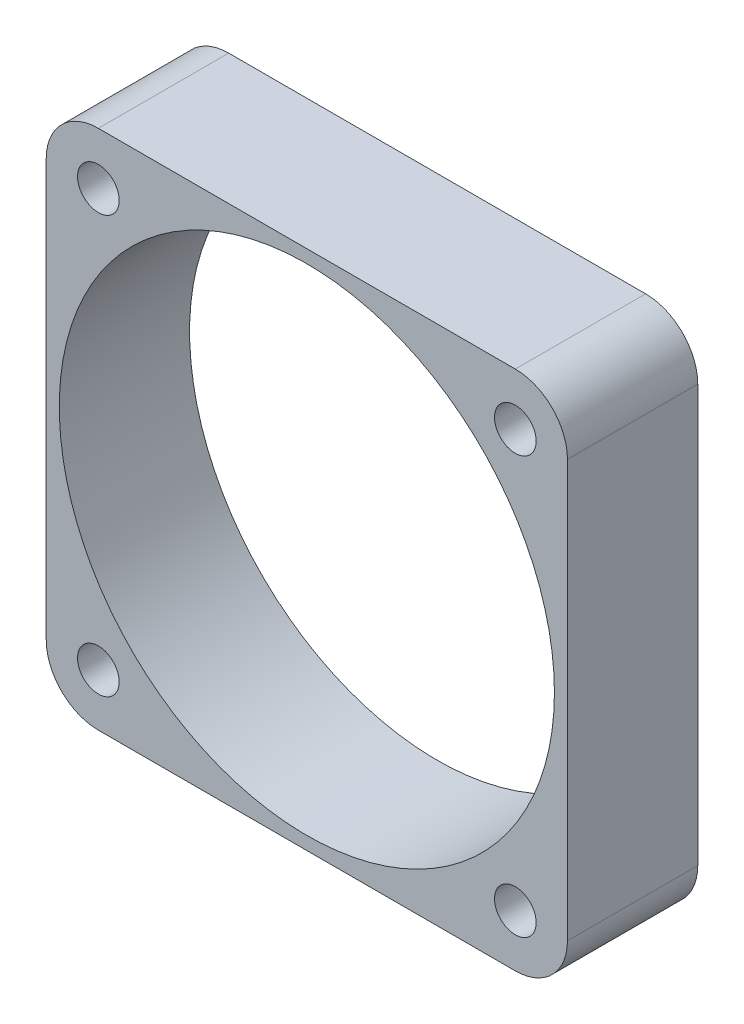
ISO-10303-21;
HEADER;
FILE_DESCRIPTION(('STEP AP214'),'2;1');
FILE_NAME('part.step','',(''),(''),'','','');
FILE_SCHEMA(('AUTOMOTIVE_DESIGN { 1 0 10303 214 1 1 1 1 }'));
ENDSEC;
DATA;
#1=APPLICATION_CONTEXT('core data for automotive mechanical design processes');
#2=APPLICATION_PROTOCOL_DEFINITION('international standard','automotive_design',2000,#1);
#3=PRODUCT_CONTEXT('',#1,'mechanical');
#4=PRODUCT('Part','Part','',(#3));
#5=PRODUCT_RELATED_PRODUCT_CATEGORY('part','',(#4));
#6=PRODUCT_DEFINITION_FORMATION('','',#4);
#7=PRODUCT_DEFINITION_CONTEXT('part definition',#1,'design');
#8=PRODUCT_DEFINITION('design','',#6,#7);
#9=PRODUCT_DEFINITION_SHAPE('','',#8);
#10=(LENGTH_UNIT() NAMED_UNIT(*) SI_UNIT(.MILLI.,.METRE.));
#11=(NAMED_UNIT(*) PLANE_ANGLE_UNIT() SI_UNIT($,.RADIAN.));
#12=(NAMED_UNIT(*) SI_UNIT($,.STERADIAN.) SOLID_ANGLE_UNIT());
#13=UNCERTAINTY_MEASURE_WITH_UNIT(LENGTH_MEASURE(1.E-05),#10,'distance_accuracy_value','');
#14=(GEOMETRIC_REPRESENTATION_CONTEXT(3) GLOBAL_UNCERTAINTY_ASSIGNED_CONTEXT((#13)) GLOBAL_UNIT_ASSIGNED_CONTEXT((#10,
#11,#12)) REPRESENTATION_CONTEXT('',''));
#15=CARTESIAN_POINT('',(0.,0.,0.));
#16=DIRECTION('',(0.,0.,1.));
#17=DIRECTION('',(1.,0.,0.));
#18=AXIS2_PLACEMENT_3D('',#15,#16,#17);
#19=CARTESIAN_POINT('',(-16.,16.,10.));
#20=DIRECTION('',(0.,0.,-1.));
#21=DIRECTION('',(-1.,0.,0.));
#22=AXIS2_PLACEMENT_3D('',#19,#20,#21);
#23=PLANE('',#22);
#24=CARTESIAN_POINT('',(16.,-16.,10.));
#25=DIRECTION('',(0.,0.,1.));
#26=DIRECTION('',(1.,0.,0.));
#27=AXIS2_PLACEMENT_3D('',#24,#25,#26);
#28=CIRCLE('',#27,1.6);
#29=CARTESIAN_POINT('',(17.6,-16.,10.));
#30=VERTEX_POINT('',#29);
#31=EDGE_CURVE('E192',#30,#30,#28,.T.);
#32=ORIENTED_EDGE('',*,*,#31,.F.);
#33=EDGE_LOOP('',(#32));
#34=FACE_BOUND('',#33,.T.);
#35=CARTESIAN_POINT('',(-16.,16.,10.));
#36=DIRECTION('',(0.,0.,1.));
#37=DIRECTION('',(1.,0.,0.));
#38=AXIS2_PLACEMENT_3D('',#35,#36,#37);
#39=CIRCLE('',#38,1.6);
#40=CARTESIAN_POINT('',(-14.4,16.,10.));
#41=VERTEX_POINT('',#40);
#42=EDGE_CURVE('E180',#41,#41,#39,.T.);
#43=ORIENTED_EDGE('',*,*,#42,.F.);
#44=EDGE_LOOP('',(#43));
#45=FACE_BOUND('',#44,.T.);
#46=CARTESIAN_POINT('',(-16.,16.,10.));
#47=DIRECTION('',(0.,0.,1.));
#48=DIRECTION('',(-1.,0.,0.));
#49=AXIS2_PLACEMENT_3D('',#46,#47,#48);
#50=CIRCLE('',#49,4.);
#51=CARTESIAN_POINT('',(-16.,20.,10.));
#52=VERTEX_POINT('',#51);
#53=CARTESIAN_POINT('',(-20.,16.,10.));
#54=VERTEX_POINT('',#53);
#55=EDGE_CURVE('E143',#52,#54,#50,.T.);
#56=ORIENTED_EDGE('',*,*,#55,.T.);
#57=DIRECTION('',(0.,-1.,0.));
#58=VECTOR('',#57,1.);
#59=CARTESIAN_POINT('',(-20.,-16.,10.));
#60=LINE('',#59,#58);
#61=CARTESIAN_POINT('',(-20.,-16.,10.));
#62=VERTEX_POINT('',#61);
#63=EDGE_CURVE('E91',#54,#62,#60,.T.);
#64=ORIENTED_EDGE('',*,*,#63,.T.);
#65=CARTESIAN_POINT('',(-16.,-16.,10.));
#66=DIRECTION('',(0.,0.,1.));
#67=DIRECTION('',(-1.,0.,0.));
#68=AXIS2_PLACEMENT_3D('',#65,#66,#67);
#69=CIRCLE('',#68,4.);
#70=CARTESIAN_POINT('',(-16.,-20.,10.));
#71=VERTEX_POINT('',#70);
#72=EDGE_CURVE('E158',#62,#71,#69,.T.);
#73=ORIENTED_EDGE('',*,*,#72,.T.);
#74=DIRECTION('',(1.,0.,0.));
#75=VECTOR('',#74,1.);
#76=CARTESIAN_POINT('',(-16.,-20.,10.));
#77=LINE('',#76,#75);
#78=CARTESIAN_POINT('',(16.,-20.,10.));
#79=VERTEX_POINT('',#78);
#80=EDGE_CURVE('E171',#71,#79,#77,.T.);
#81=ORIENTED_EDGE('',*,*,#80,.T.);
#82=CARTESIAN_POINT('',(16.,-16.,10.));
#83=DIRECTION('',(0.,0.,1.));
#84=DIRECTION('',(-1.,0.,0.));
#85=AXIS2_PLACEMENT_3D('',#82,#83,#84);
#86=CIRCLE('',#85,4.);
#87=CARTESIAN_POINT('',(20.,-16.,10.));
#88=VERTEX_POINT('',#87);
#89=EDGE_CURVE('E110',#79,#88,#86,.T.);
#90=ORIENTED_EDGE('',*,*,#89,.T.);
#91=DIRECTION('',(0.,1.,0.));
#92=VECTOR('',#91,1.);
#93=CARTESIAN_POINT('',(20.,16.,10.));
#94=LINE('',#93,#92);
#95=CARTESIAN_POINT('',(20.,16.,10.));
#96=VERTEX_POINT('',#95);
#97=EDGE_CURVE('E104',#88,#96,#94,.T.);
#98=ORIENTED_EDGE('',*,*,#97,.T.);
#99=CARTESIAN_POINT('',(16.,16.,10.));
#100=DIRECTION('',(0.,0.,1.));
#101=DIRECTION('',(-1.,0.,0.));
#102=AXIS2_PLACEMENT_3D('',#99,#100,#101);
#103=CIRCLE('',#102,4.);
#104=CARTESIAN_POINT('',(16.,20.,10.));
#105=VERTEX_POINT('',#104);
#106=EDGE_CURVE('E108',#96,#105,#103,.T.);
#107=ORIENTED_EDGE('',*,*,#106,.T.);
#108=DIRECTION('',(-1.,0.,0.));
#109=VECTOR('',#108,1.);
#110=CARTESIAN_POINT('',(-16.,20.,10.));
#111=LINE('',#110,#109);
#112=EDGE_CURVE('E48',#105,#52,#111,.T.);
#113=ORIENTED_EDGE('',*,*,#112,.T.);
#114=EDGE_LOOP('',(#56,#64,#73,#81,#90,#98,#107,#113));
#115=FACE_BOUND('',#114,.T.);
#116=CARTESIAN_POINT('',(0.,0.,10.));
#117=DIRECTION('',(0.,0.,1.));
#118=DIRECTION('',(1.,0.,0.));
#119=AXIS2_PLACEMENT_3D('',#116,#117,#118);
#120=CIRCLE('',#119,19.);
#121=CARTESIAN_POINT('',(19.,0.,10.));
#122=VERTEX_POINT('',#121);
#123=EDGE_CURVE('E132',#122,#122,#120,.T.);
#124=ORIENTED_EDGE('',*,*,#123,.F.);
#125=EDGE_LOOP('',(#124));
#126=FACE_BOUND('',#125,.T.);
#127=CARTESIAN_POINT('',(16.,16.,10.));
#128=DIRECTION('',(0.,0.,1.));
#129=DIRECTION('',(1.,0.,0.));
#130=AXIS2_PLACEMENT_3D('',#127,#128,#129);
#131=CIRCLE('',#130,1.6);
#132=CARTESIAN_POINT('',(17.6,16.,10.));
#133=VERTEX_POINT('',#132);
#134=EDGE_CURVE('E186',#133,#133,#131,.T.);
#135=ORIENTED_EDGE('',*,*,#134,.F.);
#136=EDGE_LOOP('',(#135));
#137=FACE_BOUND('',#136,.T.);
#138=CARTESIAN_POINT('',(-16.,-16.,10.));
#139=DIRECTION('',(0.,0.,1.));
#140=DIRECTION('',(1.,0.,0.));
#141=AXIS2_PLACEMENT_3D('',#138,#139,#140);
#142=CIRCLE('',#141,1.6);
#143=CARTESIAN_POINT('',(-14.4,-16.,10.));
#144=VERTEX_POINT('',#143);
#145=EDGE_CURVE('E198',#144,#144,#142,.T.);
#146=ORIENTED_EDGE('',*,*,#145,.F.);
#147=EDGE_LOOP('',(#146));
#148=FACE_BOUND('',#147,.T.);
#149=ADVANCED_FACE('F31',(#34,#45,#115,#126,#137,#148),#23,.F.);
#150=CARTESIAN_POINT('',(-16.,16.,0.));
#151=DIRECTION('',(0.,0.,-1.));
#152=DIRECTION('',(-1.,0.,0.));
#153=AXIS2_PLACEMENT_3D('',#150,#151,#152);
#154=PLANE('',#153);
#155=CARTESIAN_POINT('',(16.,-16.,0.));
#156=DIRECTION('',(0.,0.,1.));
#157=DIRECTION('',(1.,0.,0.));
#158=AXIS2_PLACEMENT_3D('',#155,#156,#157);
#159=CIRCLE('',#158,1.6);
#160=CARTESIAN_POINT('',(17.6,-16.,0.));
#161=VERTEX_POINT('',#160);
#162=EDGE_CURVE('E195',#161,#161,#159,.T.);
#163=ORIENTED_EDGE('',*,*,#162,.T.);
#164=EDGE_LOOP('',(#163));
#165=FACE_BOUND('',#164,.T.);
#166=CARTESIAN_POINT('',(-16.,16.,0.));
#167=DIRECTION('',(0.,0.,1.));
#168=DIRECTION('',(1.,0.,0.));
#169=AXIS2_PLACEMENT_3D('',#166,#167,#168);
#170=CIRCLE('',#169,1.6);
#171=CARTESIAN_POINT('',(-14.4,16.,0.));
#172=VERTEX_POINT('',#171);
#173=EDGE_CURVE('E183',#172,#172,#170,.T.);
#174=ORIENTED_EDGE('',*,*,#173,.T.);
#175=EDGE_LOOP('',(#174));
#176=FACE_BOUND('',#175,.T.);
#177=CARTESIAN_POINT('',(-16.,16.,0.));
#178=DIRECTION('',(0.,0.,1.));
#179=DIRECTION('',(-1.,0.,0.));
#180=AXIS2_PLACEMENT_3D('',#177,#178,#179);
#181=CIRCLE('',#180,4.);
#182=CARTESIAN_POINT('',(-16.,20.,0.));
#183=VERTEX_POINT('',#182);
#184=CARTESIAN_POINT('',(-20.,16.,0.));
#185=VERTEX_POINT('',#184);
#186=EDGE_CURVE('E128',#183,#185,#181,.T.);
#187=ORIENTED_EDGE('',*,*,#186,.F.);
#188=DIRECTION('',(-1.,0.,0.));
#189=VECTOR('',#188,1.);
#190=CARTESIAN_POINT('',(-16.,20.,0.));
#191=LINE('',#190,#189);
#192=CARTESIAN_POINT('',(16.,20.,0.));
#193=VERTEX_POINT('',#192);
#194=EDGE_CURVE('E83',#193,#183,#191,.T.);
#195=ORIENTED_EDGE('',*,*,#194,.F.);
#196=CARTESIAN_POINT('',(16.,16.,0.));
#197=DIRECTION('',(0.,0.,1.));
#198=DIRECTION('',(-1.,0.,0.));
#199=AXIS2_PLACEMENT_3D('',#196,#197,#198);
#200=CIRCLE('',#199,4.);
#201=CARTESIAN_POINT('',(20.,16.,0.));
#202=VERTEX_POINT('',#201);
#203=EDGE_CURVE('E77',#202,#193,#200,.T.);
#204=ORIENTED_EDGE('',*,*,#203,.F.);
#205=DIRECTION('',(0.,1.,0.));
#206=VECTOR('',#205,1.);
#207=CARTESIAN_POINT('',(20.,16.,0.));
#208=LINE('',#207,#206);
#209=CARTESIAN_POINT('',(20.,-16.,0.));
#210=VERTEX_POINT('',#209);
#211=EDGE_CURVE('E118',#210,#202,#208,.T.);
#212=ORIENTED_EDGE('',*,*,#211,.F.);
#213=CARTESIAN_POINT('',(16.,-16.,0.));
#214=DIRECTION('',(0.,0.,1.));
#215=DIRECTION('',(-1.,0.,0.));
#216=AXIS2_PLACEMENT_3D('',#213,#214,#215);
#217=CIRCLE('',#216,4.);
#218=CARTESIAN_POINT('',(16.,-20.,0.));
#219=VERTEX_POINT('',#218);
#220=EDGE_CURVE('E138',#219,#210,#217,.T.);
#221=ORIENTED_EDGE('',*,*,#220,.F.);
#222=DIRECTION('',(1.,0.,0.));
#223=VECTOR('',#222,1.);
#224=CARTESIAN_POINT('',(-16.,-20.,0.));
#225=LINE('',#224,#223);
#226=CARTESIAN_POINT('',(-16.,-20.,0.));
#227=VERTEX_POINT('',#226);
#228=EDGE_CURVE('E136',#227,#219,#225,.T.);
#229=ORIENTED_EDGE('',*,*,#228,.F.);
#230=CARTESIAN_POINT('',(-16.,-16.,0.));
#231=DIRECTION('',(0.,0.,1.));
#232=DIRECTION('',(-1.,0.,0.));
#233=AXIS2_PLACEMENT_3D('',#230,#231,#232);
#234=CIRCLE('',#233,4.);
#235=CARTESIAN_POINT('',(-20.,-16.,0.));
#236=VERTEX_POINT('',#235);
#237=EDGE_CURVE('E134',#236,#227,#234,.T.);
#238=ORIENTED_EDGE('',*,*,#237,.F.);
#239=DIRECTION('',(0.,-1.,0.));
#240=VECTOR('',#239,1.);
#241=CARTESIAN_POINT('',(-20.,-16.,0.));
#242=LINE('',#241,#240);
#243=EDGE_CURVE('E131',#185,#236,#242,.T.);
#244=ORIENTED_EDGE('',*,*,#243,.F.);
#245=EDGE_LOOP('',(#187,#195,#204,#212,#221,#229,#238,#244));
#246=FACE_BOUND('',#245,.T.);
#247=CARTESIAN_POINT('',(0.,0.,0.));
#248=DIRECTION('',(0.,0.,1.));
#249=DIRECTION('',(1.,0.,0.));
#250=AXIS2_PLACEMENT_3D('',#247,#248,#249);
#251=CIRCLE('',#250,19.);
#252=CARTESIAN_POINT('',(19.,0.,0.));
#253=VERTEX_POINT('',#252);
#254=EDGE_CURVE('E177',#253,#253,#251,.T.);
#255=ORIENTED_EDGE('',*,*,#254,.T.);
#256=EDGE_LOOP('',(#255));
#257=FACE_BOUND('',#256,.T.);
#258=CARTESIAN_POINT('',(16.,16.,0.));
#259=DIRECTION('',(0.,0.,1.));
#260=DIRECTION('',(1.,0.,0.));
#261=AXIS2_PLACEMENT_3D('',#258,#259,#260);
#262=CIRCLE('',#261,1.6);
#263=CARTESIAN_POINT('',(17.6,16.,0.));
#264=VERTEX_POINT('',#263);
#265=EDGE_CURVE('E189',#264,#264,#262,.T.);
#266=ORIENTED_EDGE('',*,*,#265,.T.);
#267=EDGE_LOOP('',(#266));
#268=FACE_BOUND('',#267,.T.);
#269=CARTESIAN_POINT('',(-16.,-16.,0.));
#270=DIRECTION('',(0.,0.,1.));
#271=DIRECTION('',(1.,0.,0.));
#272=AXIS2_PLACEMENT_3D('',#269,#270,#271);
#273=CIRCLE('',#272,1.6);
#274=CARTESIAN_POINT('',(-14.4,-16.,0.));
#275=VERTEX_POINT('',#274);
#276=EDGE_CURVE('E201',#275,#275,#273,.T.);
#277=ORIENTED_EDGE('',*,*,#276,.T.);
#278=EDGE_LOOP('',(#277));
#279=FACE_BOUND('',#278,.T.);
#280=ADVANCED_FACE('F162',(#165,#176,#246,#257,#268,#279),#154,.T.);
#281=CARTESIAN_POINT('',(-16.,16.,10.));
#282=DIRECTION('',(0.,0.,-1.));
#283=DIRECTION('',(-1.,0.,0.));
#284=AXIS2_PLACEMENT_3D('',#281,#282,#283);
#285=CYLINDRICAL_SURFACE('',#284,4.);
#286=ORIENTED_EDGE('',*,*,#186,.T.);
#287=DIRECTION('',(0.,0.,-1.));
#288=VECTOR('',#287,1.);
#289=CARTESIAN_POINT('',(-20.,16.,10.));
#290=LINE('',#289,#288);
#291=EDGE_CURVE('E11',#54,#185,#290,.T.);
#292=ORIENTED_EDGE('',*,*,#291,.F.);
#293=ORIENTED_EDGE('',*,*,#55,.F.);
#294=DIRECTION('',(0.,0.,-1.));
#295=VECTOR('',#294,1.);
#296=CARTESIAN_POINT('',(-16.,20.,10.));
#297=LINE('',#296,#295);
#298=EDGE_CURVE('E124',#52,#183,#297,.T.);
#299=ORIENTED_EDGE('',*,*,#298,.T.);
#300=EDGE_LOOP('',(#286,#292,#293,#299));
#301=FACE_BOUND('',#300,.T.);
#302=ADVANCED_FACE('F33',(#301),#285,.T.);
#303=CARTESIAN_POINT('',(-20.,-16.,10.));
#304=DIRECTION('',(1.,0.,0.));
#305=DIRECTION('',(0.,0.,-1.));
#306=AXIS2_PLACEMENT_3D('',#303,#304,#305);
#307=PLANE('',#306);
#308=ORIENTED_EDGE('',*,*,#243,.T.);
#309=DIRECTION('',(0.,0.,-1.));
#310=VECTOR('',#309,1.);
#311=CARTESIAN_POINT('',(-20.,-16.,10.));
#312=LINE('',#311,#310);
#313=EDGE_CURVE('E40',#62,#236,#312,.T.);
#314=ORIENTED_EDGE('',*,*,#313,.F.);
#315=ORIENTED_EDGE('',*,*,#63,.F.);
#316=ORIENTED_EDGE('',*,*,#291,.T.);
#317=EDGE_LOOP('',(#308,#314,#315,#316));
#318=FACE_BOUND('',#317,.T.);
#319=ADVANCED_FACE('F236',(#318),#307,.F.);
#320=CARTESIAN_POINT('',(-16.,-16.,10.));
#321=DIRECTION('',(0.,0.,-1.));
#322=DIRECTION('',(-1.,0.,0.));
#323=AXIS2_PLACEMENT_3D('',#320,#321,#322);
#324=CYLINDRICAL_SURFACE('',#323,4.);
#325=ORIENTED_EDGE('',*,*,#237,.T.);
#326=DIRECTION('',(0.,0.,-1.));
#327=VECTOR('',#326,1.);
#328=CARTESIAN_POINT('',(-16.,-20.,10.));
#329=LINE('',#328,#327);
#330=EDGE_CURVE('E150',#71,#227,#329,.T.);
#331=ORIENTED_EDGE('',*,*,#330,.F.);
#332=ORIENTED_EDGE('',*,*,#72,.F.);
#333=ORIENTED_EDGE('',*,*,#313,.T.);
#334=EDGE_LOOP('',(#325,#331,#332,#333));
#335=FACE_BOUND('',#334,.T.);
#336=ADVANCED_FACE('F156',(#335),#324,.T.);
#337=CARTESIAN_POINT('',(-16.,-20.,10.));
#338=DIRECTION('',(0.,1.,0.));
#339=DIRECTION('',(0.,0.,1.));
#340=AXIS2_PLACEMENT_3D('',#337,#338,#339);
#341=PLANE('',#340);
#342=ORIENTED_EDGE('',*,*,#228,.T.);
#343=DIRECTION('',(0.,0.,-1.));
#344=VECTOR('',#343,1.);
#345=CARTESIAN_POINT('',(16.,-20.,10.));
#346=LINE('',#345,#344);
#347=EDGE_CURVE('E147',#79,#219,#346,.T.);
#348=ORIENTED_EDGE('',*,*,#347,.F.);
#349=ORIENTED_EDGE('',*,*,#80,.F.);
#350=ORIENTED_EDGE('',*,*,#330,.T.);
#351=EDGE_LOOP('',(#342,#348,#349,#350));
#352=FACE_BOUND('',#351,.T.);
#353=ADVANCED_FACE('F167',(#352),#341,.F.);
#354=CARTESIAN_POINT('',(16.,-16.,10.));
#355=DIRECTION('',(0.,0.,-1.));
#356=DIRECTION('',(-1.,0.,0.));
#357=AXIS2_PLACEMENT_3D('',#354,#355,#356);
#358=CYLINDRICAL_SURFACE('',#357,4.);
#359=ORIENTED_EDGE('',*,*,#220,.T.);
#360=DIRECTION('',(0.,0.,-1.));
#361=VECTOR('',#360,1.);
#362=CARTESIAN_POINT('',(20.,-16.,10.));
#363=LINE('',#362,#361);
#364=EDGE_CURVE('E119',#88,#210,#363,.T.);
#365=ORIENTED_EDGE('',*,*,#364,.F.);
#366=ORIENTED_EDGE('',*,*,#89,.F.);
#367=ORIENTED_EDGE('',*,*,#347,.T.);
#368=EDGE_LOOP('',(#359,#365,#366,#367));
#369=FACE_BOUND('',#368,.T.);
#370=ADVANCED_FACE('F170',(#369),#358,.T.);
#371=CARTESIAN_POINT('',(20.,16.,10.));
#372=DIRECTION('',(-1.,0.,0.));
#373=DIRECTION('',(0.,-1.,0.));
#374=AXIS2_PLACEMENT_3D('',#371,#372,#373);
#375=PLANE('',#374);
#376=ORIENTED_EDGE('',*,*,#211,.T.);
#377=DIRECTION('',(0.,0.,-1.));
#378=VECTOR('',#377,1.);
#379=CARTESIAN_POINT('',(20.,16.,10.));
#380=LINE('',#379,#378);
#381=EDGE_CURVE('E115',#96,#202,#380,.T.);
#382=ORIENTED_EDGE('',*,*,#381,.F.);
#383=ORIENTED_EDGE('',*,*,#97,.F.);
#384=ORIENTED_EDGE('',*,*,#364,.T.);
#385=EDGE_LOOP('',(#376,#382,#383,#384));
#386=FACE_BOUND('',#385,.T.);
#387=ADVANCED_FACE('F116',(#386),#375,.F.);
#388=CARTESIAN_POINT('',(16.,16.,10.));
#389=DIRECTION('',(0.,0.,-1.));
#390=DIRECTION('',(-1.,0.,0.));
#391=AXIS2_PLACEMENT_3D('',#388,#389,#390);
#392=CYLINDRICAL_SURFACE('',#391,4.);
#393=ORIENTED_EDGE('',*,*,#203,.T.);
#394=DIRECTION('',(0.,0.,-1.));
#395=VECTOR('',#394,1.);
#396=CARTESIAN_POINT('',(16.,20.,10.));
#397=LINE('',#396,#395);
#398=EDGE_CURVE('E120',#105,#193,#397,.T.);
#399=ORIENTED_EDGE('',*,*,#398,.F.);
#400=ORIENTED_EDGE('',*,*,#106,.F.);
#401=ORIENTED_EDGE('',*,*,#381,.T.);
#402=EDGE_LOOP('',(#393,#399,#400,#401));
#403=FACE_BOUND('',#402,.T.);
#404=ADVANCED_FACE('F122',(#403),#392,.T.);
#405=CARTESIAN_POINT('',(-16.,20.,10.));
#406=DIRECTION('',(0.,-1.,0.));
#407=DIRECTION('',(0.,0.,-1.));
#408=AXIS2_PLACEMENT_3D('',#405,#406,#407);
#409=PLANE('',#408);
#410=ORIENTED_EDGE('',*,*,#194,.T.);
#411=ORIENTED_EDGE('',*,*,#298,.F.);
#412=ORIENTED_EDGE('',*,*,#112,.F.);
#413=ORIENTED_EDGE('',*,*,#398,.T.);
#414=EDGE_LOOP('',(#410,#411,#412,#413));
#415=FACE_BOUND('',#414,.T.);
#416=ADVANCED_FACE('F224',(#415),#409,.F.);
#417=CARTESIAN_POINT('',(0.,0.,10.));
#418=DIRECTION('',(0.,0.,-1.));
#419=DIRECTION('',(-1.,0.,0.));
#420=AXIS2_PLACEMENT_3D('',#417,#418,#419);
#421=CYLINDRICAL_SURFACE('',#420,19.);
#422=ORIENTED_EDGE('',*,*,#123,.T.);
#423=EDGE_LOOP('',(#422));
#424=FACE_BOUND('',#423,.T.);
#425=ORIENTED_EDGE('',*,*,#254,.F.);
#426=EDGE_LOOP('',(#425));
#427=FACE_BOUND('',#426,.T.);
#428=ADVANCED_FACE('F221',(#424,#427),#421,.F.);
#429=CARTESIAN_POINT('',(-16.,16.,10.));
#430=DIRECTION('',(0.,0.,-1.));
#431=DIRECTION('',(-1.,0.,0.));
#432=AXIS2_PLACEMENT_3D('',#429,#430,#431);
#433=CYLINDRICAL_SURFACE('',#432,1.6);
#434=ORIENTED_EDGE('',*,*,#42,.T.);
#435=EDGE_LOOP('',(#434));
#436=FACE_BOUND('',#435,.T.);
#437=ORIENTED_EDGE('',*,*,#173,.F.);
#438=EDGE_LOOP('',(#437));
#439=FACE_BOUND('',#438,.T.);
#440=ADVANCED_FACE('F300',(#436,#439),#433,.F.);
#441=CARTESIAN_POINT('',(16.,16.,10.));
#442=DIRECTION('',(0.,0.,-1.));
#443=DIRECTION('',(-1.,0.,0.));
#444=AXIS2_PLACEMENT_3D('',#441,#442,#443);
#445=CYLINDRICAL_SURFACE('',#444,1.6);
#446=ORIENTED_EDGE('',*,*,#134,.T.);
#447=EDGE_LOOP('',(#446));
#448=FACE_BOUND('',#447,.T.);
#449=ORIENTED_EDGE('',*,*,#265,.F.);
#450=EDGE_LOOP('',(#449));
#451=FACE_BOUND('',#450,.T.);
#452=ADVANCED_FACE('F308',(#448,#451),#445,.F.);
#453=CARTESIAN_POINT('',(16.,-16.,10.));
#454=DIRECTION('',(0.,0.,-1.));
#455=DIRECTION('',(-1.,0.,0.));
#456=AXIS2_PLACEMENT_3D('',#453,#454,#455);
#457=CYLINDRICAL_SURFACE('',#456,1.6);
#458=ORIENTED_EDGE('',*,*,#31,.T.);
#459=EDGE_LOOP('',(#458));
#460=FACE_BOUND('',#459,.T.);
#461=ORIENTED_EDGE('',*,*,#162,.F.);
#462=EDGE_LOOP('',(#461));
#463=FACE_BOUND('',#462,.T.);
#464=ADVANCED_FACE('F316',(#460,#463),#457,.F.);
#465=CARTESIAN_POINT('',(-16.,-16.,10.));
#466=DIRECTION('',(0.,0.,-1.));
#467=DIRECTION('',(-1.,0.,0.));
#468=AXIS2_PLACEMENT_3D('',#465,#466,#467);
#469=CYLINDRICAL_SURFACE('',#468,1.6);
#470=ORIENTED_EDGE('',*,*,#145,.T.);
#471=EDGE_LOOP('',(#470));
#472=FACE_BOUND('',#471,.T.);
#473=ORIENTED_EDGE('',*,*,#276,.F.);
#474=EDGE_LOOP('',(#473));
#475=FACE_BOUND('',#474,.T.);
#476=ADVANCED_FACE('F207',(#472,#475),#469,.F.);
#477=CLOSED_SHELL('',(#149,#280,#302,#319,#336,#353,#370,#387,#404,#416,#428,#440,#452,#464,#476));
#478=MANIFOLD_SOLID_BREP('B2',#477);
#479=ADVANCED_BREP_SHAPE_REPRESENTATION('',(#18,#478),#14);
#480=SHAPE_DEFINITION_REPRESENTATION(#9,#479);
ENDSEC;
END-ISO-10303-21;
